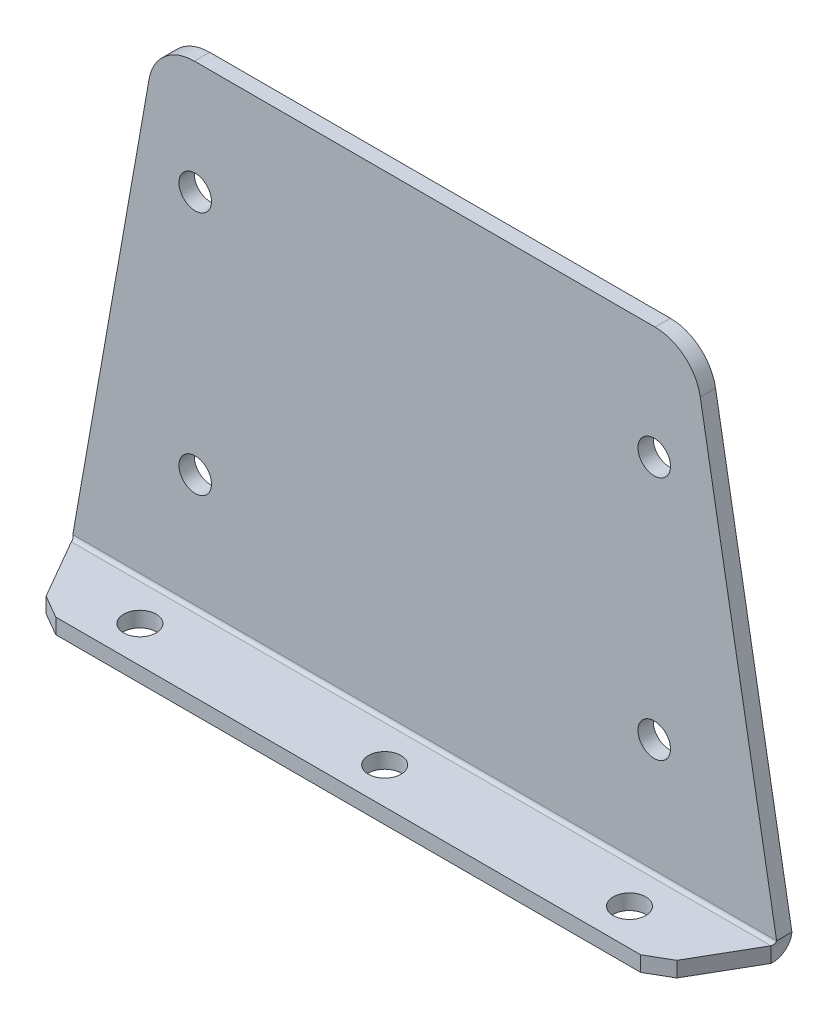
ISO-10303-21;
HEADER;
FILE_DESCRIPTION(('STEP AP214'),'2;1');
FILE_NAME('part.step','',(''),(''),'','','');
FILE_SCHEMA(('AUTOMOTIVE_DESIGN { 1 0 10303 214 1 1 1 1 }'));
ENDSEC;
DATA;
#1=APPLICATION_CONTEXT('core data for automotive mechanical design processes');
#2=APPLICATION_PROTOCOL_DEFINITION('international standard','automotive_design',2000,#1);
#3=PRODUCT_CONTEXT('',#1,'mechanical');
#4=PRODUCT('Part','Part','',(#3));
#5=PRODUCT_RELATED_PRODUCT_CATEGORY('part','',(#4));
#6=PRODUCT_DEFINITION_FORMATION('','',#4);
#7=PRODUCT_DEFINITION_CONTEXT('part definition',#1,'design');
#8=PRODUCT_DEFINITION('design','',#6,#7);
#9=PRODUCT_DEFINITION_SHAPE('','',#8);
#10=(LENGTH_UNIT() NAMED_UNIT(*) SI_UNIT(.MILLI.,.METRE.));
#11=(NAMED_UNIT(*) PLANE_ANGLE_UNIT() SI_UNIT($,.RADIAN.));
#12=(NAMED_UNIT(*) SI_UNIT($,.STERADIAN.) SOLID_ANGLE_UNIT());
#13=UNCERTAINTY_MEASURE_WITH_UNIT(LENGTH_MEASURE(1.E-05),#10,'distance_accuracy_value','');
#14=(GEOMETRIC_REPRESENTATION_CONTEXT(3) GLOBAL_UNCERTAINTY_ASSIGNED_CONTEXT((#13)) GLOBAL_UNIT_ASSIGNED_CONTEXT((#10,
#11,#12)) REPRESENTATION_CONTEXT('',''));
#15=CARTESIAN_POINT('',(0.,0.,0.));
#16=DIRECTION('',(0.,0.,1.));
#17=DIRECTION('',(1.,0.,0.));
#18=AXIS2_PLACEMENT_3D('',#15,#16,#17);
#19=CARTESIAN_POINT('',(0.,-0.7366,0.));
#20=DIRECTION('',(0.,1.,0.));
#21=DIRECTION('',(0.,0.,1.));
#22=AXIS2_PLACEMENT_3D('',#19,#20,#21);
#23=PLANE('',#22);
#24=CARTESIAN_POINT('',(123.825,-0.7366,8.3058));
#25=DIRECTION('',(0.,1.,0.));
#26=DIRECTION('',(0.,0.,1.));
#27=AXIS2_PLACEMENT_3D('',#24,#25,#26);
#28=CIRCLE('',#27,3.3782);
#29=CARTESIAN_POINT('',(123.825,-0.7366,11.684));
#30=VERTEX_POINT('',#29);
#31=EDGE_CURVE('E126',#30,#30,#28,.F.);
#32=ORIENTED_EDGE('',*,*,#31,.T.);
#33=EDGE_LOOP('',(#32));
#34=FACE_BOUND('',#33,.T.);
#35=CARTESIAN_POINT('',(73.025,-0.7366,8.3058));
#36=DIRECTION('',(0.,1.,0.));
#37=DIRECTION('',(0.,0.,1.));
#38=AXIS2_PLACEMENT_3D('',#35,#36,#37);
#39=CIRCLE('',#38,3.3782);
#40=CARTESIAN_POINT('',(73.025,-0.7366,11.684));
#41=VERTEX_POINT('',#40);
#42=EDGE_CURVE('E606',#41,#41,#39,.F.);
#43=ORIENTED_EDGE('',*,*,#42,.T.);
#44=EDGE_LOOP('',(#43));
#45=FACE_BOUND('',#44,.T.);
#46=CARTESIAN_POINT('',(22.225,-0.7366,8.3058));
#47=DIRECTION('',(0.,1.,0.));
#48=DIRECTION('',(0.,0.,1.));
#49=AXIS2_PLACEMENT_3D('',#46,#47,#48);
#50=CIRCLE('',#49,3.3782);
#51=CARTESIAN_POINT('',(22.225,-0.7366,11.684));
#52=VERTEX_POINT('',#51);
#53=EDGE_CURVE('E24',#52,#52,#50,.F.);
#54=ORIENTED_EDGE('',*,*,#53,.T.);
#55=EDGE_LOOP('',(#54));
#56=FACE_BOUND('',#55,.T.);
#57=DIRECTION('',(-0.866025403784429,0.,-0.500000000000017));
#58=VECTOR('',#57,1.);
#59=CARTESIAN_POINT('',(7.5779355233849,-0.7366,13.1253693429833));
#60=LINE('',#59,#58);
#61=CARTESIAN_POINT('',(7.57793552338496,-0.7366,13.1253693429832));
#62=VERTEX_POINT('',#61);
#63=CARTESIAN_POINT('',(12.340435523385,-0.7366,15.8749999999997));
#64=VERTEX_POINT('',#63);
#65=EDGE_CURVE('E156',#62,#64,#60,.F.);
#66=ORIENTED_EDGE('',*,*,#65,.T.);
#67=DIRECTION('',(-1.,0.,0.));
#68=VECTOR('',#67,1.);
#69=CARTESIAN_POINT('',(9.1654355233849,-0.7366,15.875));
#70=LINE('',#69,#68);
#71=CARTESIAN_POINT('',(133.709564476602,-0.7366,15.875));
#72=VERTEX_POINT('',#71);
#73=EDGE_CURVE('E171',#64,#72,#70,.F.);
#74=ORIENTED_EDGE('',*,*,#73,.T.);
#75=DIRECTION('',(-0.866025403784429,0.,0.500000000000017));
#76=VECTOR('',#75,1.);
#77=CARTESIAN_POINT('',(133.709564476602,-0.7366,15.875));
#78=LINE('',#77,#76);
#79=CARTESIAN_POINT('',(138.472064476603,-0.7366,13.1253693429839));
#80=VERTEX_POINT('',#79);
#81=EDGE_CURVE('E150',#72,#80,#78,.F.);
#82=ORIENTED_EDGE('',*,*,#81,.T.);
#83=DIRECTION('',(-0.500000000000017,0.,0.866025403784429));
#84=VECTOR('',#83,1.);
#85=CARTESIAN_POINT('',(136.884564476602,-0.7366,15.875));
#86=LINE('',#85,#84);
#87=CARTESIAN_POINT('',(145.624723791707,-0.7366,0.736600000003301));
#88=VERTEX_POINT('',#87);
#89=EDGE_CURVE('E153',#80,#88,#86,.F.);
#90=ORIENTED_EDGE('',*,*,#89,.T.);
#91=DIRECTION('',(1.,0.,0.));
#92=VECTOR('',#91,1.);
#93=CARTESIAN_POINT('',(146.05,-0.7366,0.736600000002032));
#94=LINE('',#93,#92);
#95=CARTESIAN_POINT('',(0.425276208285695,-0.7366,0.736600000001071));
#96=VERTEX_POINT('',#95);
#97=EDGE_CURVE('E80',#88,#96,#94,.F.);
#98=ORIENTED_EDGE('',*,*,#97,.T.);
#99=DIRECTION('',(-0.500000000000017,0.,-0.866025403784429));
#100=VECTOR('',#99,1.);
#101=CARTESIAN_POINT('',(0.,-0.7366,0.));
#102=LINE('',#101,#100);
#103=EDGE_CURVE('E122',#96,#62,#102,.F.);
#104=ORIENTED_EDGE('',*,*,#103,.T.);
#105=EDGE_LOOP('',(#66,#74,#82,#90,#98,#104));
#106=FACE_BOUND('',#105,.T.);
#107=ADVANCED_FACE('F17',(#34,#45,#56,#106),#23,.T.);
#108=CARTESIAN_POINT('',(136.884564476602,-3.9116,15.875));
#109=DIRECTION('',(-0.866025403784429,0.,-0.500000000000017));
#110=DIRECTION('',(-0.500000000000017,0.,0.866025403784429));
#111=AXIS2_PLACEMENT_3D('',#108,#109,#110);
#112=PLANE('',#111);
#113=DIRECTION('',(0.500000000000042,0.,-0.866025403784414));
#114=VECTOR('',#113,1.);
#115=CARTESIAN_POINT('',(138.472064476602,-3.9116,13.1253693429833));
#116=LINE('',#115,#114);
#117=CARTESIAN_POINT('',(138.472064476603,-3.9116,13.1253693429835));
#118=VERTEX_POINT('',#117);
#119=CARTESIAN_POINT('',(145.624723791712,-3.9116,0.736600000017182));
#120=VERTEX_POINT('',#119);
#121=EDGE_CURVE('E84',#118,#120,#116,.T.);
#122=ORIENTED_EDGE('',*,*,#121,.T.);
#123=DIRECTION('',(3.71810476437757E-12,-1.,8.74416762703518E-12));
#124=VECTOR('',#123,1.);
#125=CARTESIAN_POINT('',(145.624723791716,-2.3241794487742,0.736600000020483));
#126=LINE('',#125,#124);
#127=EDGE_CURVE('E85',#88,#120,#126,.T.);
#128=ORIENTED_EDGE('',*,*,#127,.F.);
#129=ORIENTED_EDGE('',*,*,#89,.F.);
#130=DIRECTION('',(0.,1.,0.));
#131=VECTOR('',#130,1.);
#132=CARTESIAN_POINT('',(138.472064476603,-3.9116,13.125369342984));
#133=LINE('',#132,#131);
#134=EDGE_CURVE('E147',#80,#118,#133,.F.);
#135=ORIENTED_EDGE('',*,*,#134,.T.);
#136=EDGE_LOOP('',(#122,#128,#129,#135));
#137=FACE_BOUND('',#136,.T.);
#138=ADVANCED_FACE('F289',(#137),#112,.F.);
#139=CARTESIAN_POINT('',(7.5779355233849,-3.9116,13.1253693429833));
#140=DIRECTION('',(0.500000000000017,0.,-0.866025403784429));
#141=DIRECTION('',(-0.866025403784429,0.,-0.500000000000017));
#142=AXIS2_PLACEMENT_3D('',#139,#140,#141);
#143=PLANE('',#142);
#144=ORIENTED_EDGE('',*,*,#65,.F.);
#145=DIRECTION('',(0.,1.,0.));
#146=VECTOR('',#145,1.);
#147=CARTESIAN_POINT('',(7.57793552338496,-3.9116,13.1253693429832));
#148=LINE('',#147,#146);
#149=CARTESIAN_POINT('',(7.57793552338492,-3.9116,13.1253693429832));
#150=VERTEX_POINT('',#149);
#151=EDGE_CURVE('E125',#62,#150,#148,.F.);
#152=ORIENTED_EDGE('',*,*,#151,.T.);
#153=DIRECTION('',(0.866025403784348,0.,0.500000000000157));
#154=VECTOR('',#153,1.);
#155=CARTESIAN_POINT('',(7.5779355233849,-3.9116,13.1253693429833));
#156=LINE('',#155,#154);
#157=CARTESIAN_POINT('',(12.340435523385,-3.91159998806136,15.875));
#158=VERTEX_POINT('',#157);
#159=EDGE_CURVE('E134',#150,#158,#156,.T.);
#160=ORIENTED_EDGE('',*,*,#159,.T.);
#161=DIRECTION('',(0.,1.,0.));
#162=VECTOR('',#161,1.);
#163=CARTESIAN_POINT('',(12.3404355233849,-3.9116,15.875));
#164=LINE('',#163,#162);
#165=EDGE_CURVE('E161',#158,#64,#164,.T.);
#166=ORIENTED_EDGE('',*,*,#165,.T.);
#167=EDGE_LOOP('',(#144,#152,#160,#166));
#168=FACE_BOUND('',#167,.T.);
#169=ADVANCED_FACE('F293',(#168),#143,.F.);
#170=CARTESIAN_POINT('',(9.1654355233849,-3.9116,15.875));
#171=DIRECTION('',(0.,0.,-1.));
#172=DIRECTION('',(-1.,0.,0.));
#173=AXIS2_PLACEMENT_3D('',#170,#171,#172);
#174=PLANE('',#173);
#175=ORIENTED_EDGE('',*,*,#73,.F.);
#176=ORIENTED_EDGE('',*,*,#165,.F.);
#177=DIRECTION('',(1.,0.,0.));
#178=VECTOR('',#177,1.);
#179=CARTESIAN_POINT('',(0.,-3.9116,15.875));
#180=LINE('',#179,#178);
#181=CARTESIAN_POINT('',(133.709564476602,-3.91159996269216,15.875));
#182=VERTEX_POINT('',#181);
#183=EDGE_CURVE('E137',#158,#182,#180,.T.);
#184=ORIENTED_EDGE('',*,*,#183,.T.);
#185=DIRECTION('',(0.,1.,0.));
#186=VECTOR('',#185,1.);
#187=CARTESIAN_POINT('',(133.709564476602,-3.9116,15.875));
#188=LINE('',#187,#186);
#189=EDGE_CURVE('E166',#182,#72,#188,.T.);
#190=ORIENTED_EDGE('',*,*,#189,.T.);
#191=EDGE_LOOP('',(#175,#176,#184,#190));
#192=FACE_BOUND('',#191,.T.);
#193=ADVANCED_FACE('F297',(#192),#174,.F.);
#194=CARTESIAN_POINT('',(133.709564476602,-3.9116,15.875));
#195=DIRECTION('',(-0.500000000000017,0.,-0.866025403784429));
#196=DIRECTION('',(-0.866025403784429,0.,0.500000000000017));
#197=AXIS2_PLACEMENT_3D('',#194,#195,#196);
#198=PLANE('',#197);
#199=ORIENTED_EDGE('',*,*,#81,.F.);
#200=ORIENTED_EDGE('',*,*,#189,.F.);
#201=DIRECTION('',(0.866025403784348,0.,-0.500000000000156));
#202=VECTOR('',#201,1.);
#203=CARTESIAN_POINT('',(133.709564476602,-3.9116,15.875));
#204=LINE('',#203,#202);
#205=EDGE_CURVE('E141',#182,#118,#204,.T.);
#206=ORIENTED_EDGE('',*,*,#205,.T.);
#207=ORIENTED_EDGE('',*,*,#134,.F.);
#208=EDGE_LOOP('',(#199,#200,#206,#207));
#209=FACE_BOUND('',#208,.T.);
#210=ADVANCED_FACE('F301',(#209),#198,.F.);
#211=CARTESIAN_POINT('',(22.225,-3.9116,8.3058));
#212=DIRECTION('',(0.,1.,0.));
#213=DIRECTION('',(0.,0.,1.));
#214=AXIS2_PLACEMENT_3D('',#211,#212,#213);
#215=CYLINDRICAL_SURFACE('',#214,3.3782);
#216=ORIENTED_EDGE('',*,*,#53,.F.);
#217=EDGE_LOOP('',(#216));
#218=FACE_BOUND('',#217,.T.);
#219=CARTESIAN_POINT('',(22.225,-3.9116,8.3058));
#220=DIRECTION('',(0.,1.,0.));
#221=DIRECTION('',(0.,0.,1.));
#222=AXIS2_PLACEMENT_3D('',#219,#220,#221);
#223=CIRCLE('',#222,3.3782);
#224=CARTESIAN_POINT('',(22.225,-3.9116,11.684));
#225=VERTEX_POINT('',#224);
#226=EDGE_CURVE('E144',#225,#225,#223,.F.);
#227=ORIENTED_EDGE('',*,*,#226,.T.);
#228=EDGE_LOOP('',(#227));
#229=FACE_BOUND('',#228,.T.);
#230=ADVANCED_FACE('F305',(#218,#229),#215,.F.);
#231=CARTESIAN_POINT('',(73.025,-3.9116,8.3058));
#232=DIRECTION('',(0.,1.,0.));
#233=DIRECTION('',(0.,0.,1.));
#234=AXIS2_PLACEMENT_3D('',#231,#232,#233);
#235=CYLINDRICAL_SURFACE('',#234,3.3782);
#236=ORIENTED_EDGE('',*,*,#42,.F.);
#237=EDGE_LOOP('',(#236));
#238=FACE_BOUND('',#237,.T.);
#239=CARTESIAN_POINT('',(73.025,-3.9116,8.3058));
#240=DIRECTION('',(0.,1.,0.));
#241=DIRECTION('',(0.,0.,1.));
#242=AXIS2_PLACEMENT_3D('',#239,#240,#241);
#243=CIRCLE('',#242,3.3782);
#244=CARTESIAN_POINT('',(73.025,-3.9116,11.684));
#245=VERTEX_POINT('',#244);
#246=EDGE_CURVE('E429',#245,#245,#243,.F.);
#247=ORIENTED_EDGE('',*,*,#246,.T.);
#248=EDGE_LOOP('',(#247));
#249=FACE_BOUND('',#248,.T.);
#250=ADVANCED_FACE('F309',(#238,#249),#235,.F.);
#251=CARTESIAN_POINT('',(123.825,-3.9116,8.3058));
#252=DIRECTION('',(0.,1.,0.));
#253=DIRECTION('',(0.,0.,1.));
#254=AXIS2_PLACEMENT_3D('',#251,#252,#253);
#255=CYLINDRICAL_SURFACE('',#254,3.3782);
#256=ORIENTED_EDGE('',*,*,#31,.F.);
#257=EDGE_LOOP('',(#256));
#258=FACE_BOUND('',#257,.T.);
#259=CARTESIAN_POINT('',(123.825,-3.9116,8.3058));
#260=DIRECTION('',(0.,1.,0.));
#261=DIRECTION('',(0.,0.,1.));
#262=AXIS2_PLACEMENT_3D('',#259,#260,#261);
#263=CIRCLE('',#262,3.3782);
#264=CARTESIAN_POINT('',(123.825,-3.9116,11.684));
#265=VERTEX_POINT('',#264);
#266=EDGE_CURVE('E427',#265,#265,#263,.F.);
#267=ORIENTED_EDGE('',*,*,#266,.T.);
#268=EDGE_LOOP('',(#267));
#269=FACE_BOUND('',#268,.T.);
#270=ADVANCED_FACE('F312',(#258,#269),#255,.F.);
#271=CARTESIAN_POINT('',(0.,-3.9116,0.));
#272=DIRECTION('',(0.866025403784429,0.,-0.500000000000017));
#273=DIRECTION('',(-0.500000000000017,0.,-0.866025403784429));
#274=AXIS2_PLACEMENT_3D('',#271,#272,#273);
#275=PLANE('',#274);
#276=ORIENTED_EDGE('',*,*,#103,.F.);
#277=DIRECTION('',(0.,1.,0.));
#278=VECTOR('',#277,1.);
#279=CARTESIAN_POINT('',(0.425276208285053,-2.32417944833777,0.73660000000004));
#280=LINE('',#279,#278);
#281=CARTESIAN_POINT('',(0.425276208285358,-3.9116,0.736600000000482));
#282=VERTEX_POINT('',#281);
#283=EDGE_CURVE('E98',#282,#96,#280,.T.);
#284=ORIENTED_EDGE('',*,*,#283,.F.);
#285=DIRECTION('',(0.500000000000012,0.,0.866025403784432));
#286=VECTOR('',#285,1.);
#287=CARTESIAN_POINT('',(0.4252762082851,-3.9116,0.7366));
#288=LINE('',#287,#286);
#289=EDGE_CURVE('E138',#282,#150,#288,.T.);
#290=ORIENTED_EDGE('',*,*,#289,.T.);
#291=ORIENTED_EDGE('',*,*,#151,.F.);
#292=EDGE_LOOP('',(#276,#284,#290,#291));
#293=FACE_BOUND('',#292,.T.);
#294=ADVANCED_FACE('F260',(#293),#275,.F.);
#295=CARTESIAN_POINT('',(146.05,0.,0.7366));
#296=DIRECTION('',(1.,0.,0.));
#297=DIRECTION('',(0.,0.,-1.));
#298=AXIS2_PLACEMENT_3D('',#295,#296,#297);
#299=CYLINDRICAL_SURFACE('',#298,0.7366);
#300=ORIENTED_EDGE('',*,*,#97,.F.);
#301=CARTESIAN_POINT('',(146.04999999999,1.1067328360326E-12,0.));
#302=CARTESIAN_POINT('',(146.033761789014,-0.0441889016254141,-4.553203150032E-05));
#303=CARTESIAN_POINT('',(146.017524010753,-0.0883634020784472,0.00397345733484728));
#304=CARTESIAN_POINT('',(145.985061173071,-0.175256986932487,0.0198050848037792));
#305=CARTESIAN_POINT('',(145.968836114294,-0.21797725044977,0.031611242645291));
#306=CARTESIAN_POINT('',(145.936374648382,-0.30063656916147,0.0626913891340414));
#307=CARTESIAN_POINT('',(145.920138239916,-0.340574080078137,0.0819694859722505));
#308=CARTESIAN_POINT('',(145.887675090312,-0.416347638988337,0.12735245340074));
#309=CARTESIAN_POINT('',(145.871448347746,-0.45218479245855,0.153455477692408));
#310=CARTESIAN_POINT('',(145.838992329576,-0.518603315317671,0.21164313271838));
#311=CARTESIAN_POINT('',(145.822763055231,-0.549185793515106,0.243726498532291));
#312=CARTESIAN_POINT('',(145.790311107363,-0.60412072947896,0.312848003192188));
#313=CARTESIAN_POINT('',(145.774088433644,-0.62847338760231,0.349885982634735));
#314=CARTESIAN_POINT('',(145.741626857501,-0.67017638253569,0.427737265437257));
#315=CARTESIAN_POINT('',(145.725387951725,-0.687521744150973,0.468553225988095));
#316=CARTESIAN_POINT('',(145.692927926748,-0.714610257306961,0.552602413483236));
#317=CARTESIAN_POINT('',(145.676706814498,-0.724364024425833,0.59583217408322));
#318=CARTESIAN_POINT('',(145.654534749005,-0.732317760925936,0.655633121450345));
#319=CARTESIAN_POINT('',(145.648567129784,-0.733924220432763,0.671799270050664));
#320=CARTESIAN_POINT('',(145.636641875988,-0.736063987553253,0.704174645253995));
#321=CARTESIAN_POINT('',(145.630684241773,-0.736599124021749,0.720383751063802));
#322=CARTESIAN_POINT('',(145.624723791714,-0.736600000000001,0.736600000007147));
#323=B_SPLINE_CURVE_WITH_KNOTS('',3,(#301,#302,#303,#304,#305,#306,#307,#308,#309,#310,#311,
#312,#313,#314,#315,#316,#317,#318,#319,#320,#321,#322),.UNSPECIFIED.,.F.,.F.,(4,2,2,2,2,2,2,2,
2,2,4),(0.,0.141043225038701,0.281969225733589,0.422972819953411,0.563938308879362,
0.704874015525676,0.845805188975791,0.986836248727522,1.12766974399173,1.17956570731466,
1.2313730032717),.UNSPECIFIED.);
#324=CARTESIAN_POINT('',(146.04999999999,0.,0.));
#325=VERTEX_POINT('',#324);
#326=EDGE_CURVE('E75',#325,#88,#323,.T.);
#327=ORIENTED_EDGE('',*,*,#326,.F.);
#328=DIRECTION('',(-1.,0.,0.));
#329=VECTOR('',#328,1.);
#330=CARTESIAN_POINT('',(0.,2.5943691639437E-13,0.));
#331=LINE('',#330,#329);
#332=CARTESIAN_POINT('',(0.,1.29718458197185E-13,0.));
#333=VERTEX_POINT('',#332);
#334=EDGE_CURVE('E79',#325,#333,#331,.T.);
#335=ORIENTED_EDGE('',*,*,#334,.T.);
#336=CARTESIAN_POINT('',(0.425276208285155,-0.7366,0.736600000000611));
#337=CARTESIAN_POINT('',(0.409037997312601,-0.73664553203122,0.692411098372825));
#338=CARTESIAN_POINT('',(0.392800219051563,-0.732626542664846,0.648236597919876));
#339=CARTESIAN_POINT('',(0.36033738136548,-0.716794915196108,0.561343013066884));
#340=CARTESIAN_POINT('',(0.344112322586021,-0.704988757354814,0.518622749550563));
#341=CARTESIAN_POINT('',(0.311650856670152,-0.673908610866497,0.435963430839904));
#342=CARTESIAN_POINT('',(0.295414448204115,-0.654630514028509,0.396025919923314));
#343=CARTESIAN_POINT('',(0.262951298600196,-0.609247546600037,0.320252361012778));
#344=CARTESIAN_POINT('',(0.246724556035551,-0.583144522308163,0.284415207542153));
#345=CARTESIAN_POINT('',(0.214268537867224,-0.524956867281687,0.217996684682353));
#346=CARTESIAN_POINT('',(0.198039263523012,-0.492873501467467,0.187414206484658));
#347=CARTESIAN_POINT('',(0.165587315655527,-0.42375199680707,0.132479270520495));
#348=CARTESIAN_POINT('',(0.149364641936729,-0.386714017364332,0.108126612397097));
#349=CARTESIAN_POINT('',(0.116903065795111,-0.308862734561835,0.0664236174639173));
#350=CARTESIAN_POINT('',(0.10066416001934,-0.268046774011259,0.049078255848796));
#351=CARTESIAN_POINT('',(0.0682041350426737,-0.183997586516882,0.0219897426930994));
#352=CARTESIAN_POINT('',(0.0519830227925919,-0.140767825917399,0.0122359755743621));
#353=CARTESIAN_POINT('',(0.029810957296554,-0.0809668785521213,0.00428223907434967));
#354=CARTESIAN_POINT('',(0.0238433380752774,-0.0648007299525817,0.0026757795675426));
#355=CARTESIAN_POINT('',(0.0119180842765338,-0.0324253547510271,0.000536012446988639));
#356=CARTESIAN_POINT('',(0.00596045006024207,-0.0162162489422153,8.75978408253096E-07));
#357=CARTESIAN_POINT('',(0.,0.,0.));
#358=B_SPLINE_CURVE_WITH_KNOTS('',3,(#336,#337,#338,#339,#340,#341,#342,#343,#344,#345,#346,
#347,#348,#349,#350,#351,#352,#353,#354,#355,#356,#357),.UNSPECIFIED.,.F.,.F.,(4,2,2,2,2,2,2,2,
2,2,4),(0.,0.141043225038912,0.281969225734052,0.422972819954025,0.563938308880143,
0.704874015526822,0.845805188977319,0.986836248727671,1.1276697439906,1.1795657073122,
1.23137300326793),.UNSPECIFIED.);
#359=EDGE_CURVE('E264',#96,#333,#358,.T.);
#360=ORIENTED_EDGE('',*,*,#359,.F.);
#361=EDGE_LOOP('',(#300,#327,#335,#360));
#362=FACE_BOUND('',#361,.T.);
#363=ADVANCED_FACE('F77',(#362),#299,.F.);
#364=CARTESIAN_POINT('',(145.587612544005,-4.08738304657646,1.30062531070989));
#365=CARTESIAN_POINT('',(145.587613050227,-2.8970504975562,1.13636788014082));
#366=CARTESIAN_POINT('',(145.587613556423,-1.70671794853797,0.972110449572012));
#367=CARTESIAN_POINT('',(145.58761406262,-0.516385399518982,0.807853019003202));
#368=CARTESIAN_POINT('',(145.599984752966,-4.11389296873304,1.11373103709075));
#369=CARTESIAN_POINT('',(145.599985013113,-2.91584016529048,1.00390181703589));
#370=CARTESIAN_POINT('',(145.59998527326,-1.71778736184614,0.89407259698077));
#371=CARTESIAN_POINT('',(145.599985533432,-0.519734558402312,0.784243376925908));
#372=CARTESIAN_POINT('',(145.647805286687,-4.16445919940632,0.384702751266314));
#373=CARTESIAN_POINT('',(145.647804928217,-2.9516804357434,0.487183613372252));
#374=CARTESIAN_POINT('',(145.647804569721,-1.73890167207972,0.589664475478444));
#375=CARTESIAN_POINT('',(145.647804211251,-0.526122908416798,0.692145337584382));
#376=CARTESIAN_POINT('',(145.731039991693,-3.91208361052884,-0.883754332543426));
#377=CARTESIAN_POINT('',(145.73104011468,-2.7728019939582,-0.411873159233492));
#378=CARTESIAN_POINT('',(145.731040237641,-1.63352037739061,0.0600080140765182));
#379=CARTESIAN_POINT('',(145.731040360628,-0.494238760822,0.531889187386376));
#380=CARTESIAN_POINT('',(145.837361895838,-2.99420532751336,-2.25760532654384));
#381=CARTESIAN_POINT('',(145.837361895838,-2.12222919865427,-1.38562919796898));
#382=CARTESIAN_POINT('',(145.837361895838,-1.25025306979595,-0.513653069394372));
#383=CARTESIAN_POINT('',(145.837361895838,-0.378276940937874,0.35832305918049));
#384=CARTESIAN_POINT('',(145.943683800085,-1.62035432965951,-3.17548361151944));
#385=CARTESIAN_POINT('',(145.943683677098,-1.14847315719413,-2.03620199466076));
#386=CARTESIAN_POINT('',(145.943683554112,-0.676591984728996,-0.89692037780285));
#387=CARTESIAN_POINT('',(145.943683431125,-0.204710812263688,0.242361239054861));
#388=CARTESIAN_POINT('',(146.026923596928,-0.351819656636902,-3.42787463672622));
#389=CARTESIAN_POINT('',(146.026923955423,-0.249361390903069,-2.21509137738751));
#390=CARTESIAN_POINT('',(146.026924313919,-0.146903125169235,-1.00230811804905));
#391=CARTESIAN_POINT('',(146.026924672414,-0.0444448594354018,0.21047514128916));
#392=CARTESIAN_POINT('',(146.074749227311,0.377286366246688,-3.377282194622));
#393=CARTESIAN_POINT('',(146.074748967012,0.267411910700382,-2.17923252882849));
#394=CARTESIAN_POINT('',(146.074748706713,0.157537455154152,-0.981182863033702));
#395=CARTESIAN_POINT('',(146.074748446414,0.0476629996078208,0.21686680276093));
#396=CARTESIAN_POINT('',(146.087126533037,0.564256217279822,-3.35075029134352));
#397=CARTESIAN_POINT('',(146.08712602651,0.399931541018478,-2.16042728134431));
#398=CARTESIAN_POINT('',(146.087125519983,0.235606864757236,-0.970104271346124));
#399=CARTESIAN_POINT('',(146.087125013482,0.071282188495917,0.220218738652041));
#400=B_SPLINE_SURFACE_WITH_KNOTS('',3,3,((#364,#365,#366,#367),(#368,#369,#370,#371),(#372,#373,
#374,#375),(#376,#377,#378,#379),(#380,#381,#382,#383),(#384,#385,#386,#387),(#388,#389,#390,
#391),(#392,#393,#394,#395),(#396,#397,#398,#399)),.UNSPECIFIED.,.F.,.F.,.F.,(4,1,1,1,1,1,4),(4,
4),(-0.08723626480821,0.,0.2500000000036,0.5000000000014,0.7499999999991,1.,1.087272189861),
(4.543612969893E-08,0.9999983845735),.UNSPECIFIED.);
#401=DIRECTION('',(0.,0.,1.));
#402=VECTOR('',#401,1.);
#403=CARTESIAN_POINT('',(146.049999999991,-1.29063426612674E-12,-3.175));
#404=LINE('',#403,#402);
#405=CARTESIAN_POINT('',(146.050000000001,-1.07167929034386E-12,-3.175));
#406=VERTEX_POINT('',#405);
#407=EDGE_CURVE('E101',#325,#406,#404,.F.);
#408=CARTESIAN_POINT('',(146.050000000012,-1.15788851248873E-12,-3.175));
#409=CARTESIAN_POINT('',(146.042366379942,-0.110287051827059,-3.1750106504649));
#410=CARTESIAN_POINT('',(146.034733349952,-0.220569103955943,-3.17033574655556));
#411=CARTESIAN_POINT('',(146.019468097599,-0.440340357702033,-3.15169721503877));
#412=CARTESIAN_POINT('',(146.011835875214,-0.549829597303584,-3.13773403545749));
#413=CARTESIAN_POINT('',(145.99657690979,-0.767160833072703,-3.10061538433101));
#414=CARTESIAN_POINT('',(145.988950166979,-0.87500401399972,-3.07746688270379));
#415=CARTESIAN_POINT('',(145.973697635792,-1.08832405707029,-3.02216621495021));
#416=CARTESIAN_POINT('',(145.966071847405,-1.19380094819698,-2.99001415916763));
#417=CARTESIAN_POINT('',(145.943187600084,-1.50565949116411,-2.88031381871414));
#418=CARTESIAN_POINT('',(145.927916173151,-1.70755692063769,-2.78950626613435));
#419=CARTESIAN_POINT('',(145.897391584483,-2.0930415727871,-2.57526926086324));
#420=CARTESIAN_POINT('',(145.882138419965,-2.27663206998078,-2.45184565659635));
#421=CARTESIAN_POINT('',(145.851623266357,-2.62045073735799,-2.17585904842747));
#422=CARTESIAN_POINT('',(145.836361277541,-2.78067959717646,-2.02329690500167));
#423=CARTESIAN_POINT('',(145.805840405345,-3.07320364485422,-1.69334983956957));
#424=CARTESIAN_POINT('',(145.790581523229,-3.20549314300702,-1.51595987371144));
#425=CARTESIAN_POINT('',(145.760058137519,-3.43835377276583,-1.14142802738998));
#426=CARTESIAN_POINT('',(145.744793633415,-3.53891840324426,-0.944282109386946));
#427=CARTESIAN_POINT('',(145.714267861359,-3.70538095861543,-0.535920177982979));
#428=CARTESIAN_POINT('',(145.69900659717,-3.7713001203934,-0.324712873568766));
#429=CARTESIAN_POINT('',(145.673908650463,-3.84976081565101,0.0293177148548672));
#430=CARTESIAN_POINT('',(145.664064602811,-3.87293787192361,0.169874407033624));
#431=CARTESIAN_POINT('',(145.644390251638,-3.90385445511806,0.452467602052166));
#432=CARTESIAN_POINT('',(145.634559949003,-3.9116164382541,0.594501648836979));
#433=CARTESIAN_POINT('',(145.624723791727,-3.91159999999999,0.736600000015479));
#434=B_SPLINE_CURVE_WITH_KNOTS('',3,(#408,#409,#410,#411,#412,#413,#414,#415,#416,#417,#418,
#419,#420,#421,#422,#423,#424,#425,#426,#427,#428,#429,#430,#431,#432,#433),.UNSPECIFIED.,.F.,
.F.,(4,2,2,2,2,2,2,2,2,2,2,2,4),(0.,0.331544885302928,0.663073779477025,0.994351585685523,
1.3256253320707,1.98790799778779,2.6500719892689,3.31221642972612,3.97449558273064,
4.63691036336616,5.29891862381989,5.72651984304269,6.15349768742148),.UNSPECIFIED.);
#435=EDGE_CURVE('E104',#406,#120,#434,.T.);
#436=ORIENTED_EDGE('',*,*,#407,.F.);
#437=ORIENTED_EDGE('',*,*,#326,.T.);
#438=ORIENTED_EDGE('',*,*,#127,.T.);
#439=ORIENTED_EDGE('',*,*,#435,.F.);
#440=EDGE_LOOP('',(#436,#437,#438,#439));
#441=FACE_BOUND('',#440,.T.);
#442=ADVANCED_FACE('F102',(#441),#400,.T.);
#443=CARTESIAN_POINT('',(0.,-3.9116,0.));
#444=DIRECTION('',(0.,1.,0.));
#445=DIRECTION('',(0.,0.,1.));
#446=AXIS2_PLACEMENT_3D('',#443,#444,#445);
#447=PLANE('',#446);
#448=ORIENTED_EDGE('',*,*,#266,.F.);
#449=EDGE_LOOP('',(#448));
#450=FACE_BOUND('',#449,.T.);
#451=ORIENTED_EDGE('',*,*,#246,.F.);
#452=EDGE_LOOP('',(#451));
#453=FACE_BOUND('',#452,.T.);
#454=ORIENTED_EDGE('',*,*,#226,.F.);
#455=EDGE_LOOP('',(#454));
#456=FACE_BOUND('',#455,.T.);
#457=ORIENTED_EDGE('',*,*,#183,.F.);
#458=ORIENTED_EDGE('',*,*,#159,.F.);
#459=ORIENTED_EDGE('',*,*,#289,.F.);
#460=DIRECTION('',(1.,0.,0.));
#461=VECTOR('',#460,1.);
#462=CARTESIAN_POINT('',(146.05,-3.9116,0.736600000001015));
#463=LINE('',#462,#461);
#464=EDGE_CURVE('E222',#120,#282,#463,.F.);
#465=ORIENTED_EDGE('',*,*,#464,.F.);
#466=ORIENTED_EDGE('',*,*,#121,.F.);
#467=ORIENTED_EDGE('',*,*,#205,.F.);
#468=EDGE_LOOP('',(#457,#458,#459,#465,#466,#467));
#469=FACE_BOUND('',#468,.T.);
#470=ADVANCED_FACE('F253',(#450,#453,#456,#469),#447,.F.);
#471=CARTESIAN_POINT('',(-0.0371112477279784,0.564025310545294,-3.35078304571794));
#472=CARTESIAN_POINT('',(-0.0371107415195166,0.399767880029316,-2.16045049698521));
#473=CARTESIAN_POINT('',(-0.0371102353110294,0.23551044951344,-0.970117948252476));
#474=CARTESIAN_POINT('',(-0.0371097291025676,0.0712530189974616,0.22021460048018));
#475=CARTESIAN_POINT('',(-0.0247390387692429,0.37713103697213,-3.3772929678669));
#476=CARTESIAN_POINT('',(-0.0247387786113913,0.267301816955114,-2.17924016471238));
#477=CARTESIAN_POINT('',(-0.0247385184535372,0.157472596938047,-0.981187361557598));
#478=CARTESIAN_POINT('',(-0.0247382582956857,0.0476433769210058,0.216865441597231));
#479=CARTESIAN_POINT('',(0.02308149496865,-0.351897248678568,-3.4278591985224));
#480=CARTESIAN_POINT('',(0.0230811364953284,-0.249416386591883,-2.2150804351531));
#481=CARTESIAN_POINT('',(0.0230807780220092,-0.146935524505122,-1.00230167178482));
#482=CARTESIAN_POINT('',(0.0230804195486901,-0.0444546624183866,0.21047709158338));
#483=CARTESIAN_POINT('',(0.106316199983177,-1.62035433220078,-3.17548360969826));
#484=CARTESIAN_POINT('',(0.106316322962306,-1.14847315900489,-2.03620199340677));
#485=CARTESIAN_POINT('',(0.106316445941435,-0.676591985809258,-0.89692037711451));
#486=CARTESIAN_POINT('',(0.106316568920564,-0.204710812613599,0.242361239178));
#487=CARTESIAN_POINT('',(0.21263810413018,-2.99420532591062,-2.25760532687861));
#488=CARTESIAN_POINT('',(0.212638104130714,-2.12222919754683,-1.38562919823162));
#489=CARTESIAN_POINT('',(0.212638104131247,-1.2502530691833,-0.513653069584872));
#490=CARTESIAN_POINT('',(0.21263810413178,-0.37827694081951,0.358323059062126));
#491=CARTESIAN_POINT('',(0.318960008351504,-3.91208361068886,-0.883754329316864));
#492=CARTESIAN_POINT('',(0.318959885370038,-2.77280199410806,-0.41187315696578));
#493=CARTESIAN_POINT('',(0.318959762388826,-1.63352037752675,0.060008015385431));
#494=CARTESIAN_POINT('',(0.31895963940736,-0.49423876094519,0.531889187736388));
#495=CARTESIAN_POINT('',(0.40219980519873,-4.1644746358423,0.384780343425328));
#496=CARTESIAN_POINT('',(0.40220016370703,-2.95169137679848,0.487238609138054));
#497=CARTESIAN_POINT('',(0.402200522215076,-1.73890811775466,0.589696874850526));
#498=CARTESIAN_POINT('',(0.402200880723122,-0.526124858710586,0.692155140563252));
#499=CARTESIAN_POINT('',(0.450025435581822,-4.11388219375332,1.11388636614229));
#500=CARTESIAN_POINT('',(0.45002517528821,-2.91583252824962,1.00401191062977));
#501=CARTESIAN_POINT('',(0.450024914994598,-1.71778286274389,0.894137455117246));
#502=CARTESIAN_POINT('',(0.450024654700986,-0.519733197239172,0.784262999604722));
#503=CARTESIAN_POINT('',(0.462402741310778,-4.08735029047992,1.30085621712996));
#504=CARTESIAN_POINT('',(0.462402234790582,-2.89702728077002,1.13653154091739));
#505=CARTESIAN_POINT('',(0.46240172827064,-1.70670427105885,0.97220686470481));
#506=CARTESIAN_POINT('',(0.462401221750444,-0.516381261348442,0.80788218849198));
#507=B_SPLINE_SURFACE_WITH_KNOTS('',3,3,((#471,#472,#473,#474),(#475,#476,#477,#478),(#479,#480,
#481,#482),(#483,#484,#485,#486),(#487,#488,#489,#490),(#491,#492,#493,#494),(#495,#496,#497,
#498),(#499,#500,#501,#502),(#503,#504,#505,#506)),.UNSPECIFIED.,.F.,.F.,.F.,(4,1,1,1,1,1,4),(4,
4),(-0.08723626480589,0.,0.2499999999998,0.4999999999998,0.7499999999997,1.,1.08727218986),
(4.505509384328E-08,0.9999983845735),.UNSPECIFIED.);
#508=CARTESIAN_POINT('',(0.425276208285114,-3.9116,0.736600000000404));
#509=CARTESIAN_POINT('',(0.417642588215241,-3.91161065046495,0.62631294817455));
#510=CARTESIAN_POINT('',(0.410009558225287,-3.90693574655565,0.516030896045715));
#511=CARTESIAN_POINT('',(0.394744305871536,-3.88829721503897,0.29625964229972));
#512=CARTESIAN_POINT('',(0.387112083486543,-3.87433403545774,0.186770402698215));
#513=CARTESIAN_POINT('',(0.371853118062408,-3.83721538433139,-0.030560833070818));
#514=CARTESIAN_POINT('',(0.364226375251249,-3.81406688270423,-0.138404013997795));
#515=CARTESIAN_POINT('',(0.348973844063834,-3.75876621495078,-0.351724057068312));
#516=CARTESIAN_POINT('',(0.341348055677026,-3.72661415916827,-0.457200948194989));
#517=CARTESIAN_POINT('',(0.318463808356487,-3.61691381871497,-0.769059491162142));
#518=CARTESIAN_POINT('',(0.303192381425579,-3.52610626613526,-0.970956920635813));
#519=CARTESIAN_POINT('',(0.272667792761912,-3.31186926086427,-1.35644157278547));
#520=CARTESIAN_POINT('',(0.257414628246566,-3.1884456565974,-1.54003206997931));
#521=CARTESIAN_POINT('',(0.226899474643139,-2.91245904842867,-1.88385073735665));
#522=CARTESIAN_POINT('',(0.211637485828908,-2.75989690500302,-2.04407959717511));
#523=CARTESIAN_POINT('',(0.181116613634918,-2.42994983957133,-2.33660364485282));
#524=CARTESIAN_POINT('',(0.16585773151867,-2.25255987371347,-2.46889314300558));
#525=CARTESIAN_POINT('',(0.135334345808393,-1.87802802739253,-2.70175377276442));
#526=CARTESIAN_POINT('',(0.120069841703081,-1.68088210938976,-2.80231840324291));
#527=CARTESIAN_POINT('',(0.0895440696450196,-1.27252017798635,-2.96878095861426));
#528=CARTESIAN_POINT('',(0.0742828054551907,-1.06131287357243,-3.03470012039235));
#529=CARTESIAN_POINT('',(0.0491848587453539,-0.707282285151048,-3.11316081564986));
#530=CARTESIAN_POINT('',(0.0393408110916334,-0.566725592974268,-3.13633787192238));
#531=CARTESIAN_POINT('',(0.0196664599157955,-0.284132397959738,-3.16725445511713));
#532=CARTESIAN_POINT('',(0.0098361572784867,-0.14209835117696,-3.17501643825352));
#533=CARTESIAN_POINT('',(0.,-4.95048864112134E-13,-3.17499999999999));
#534=B_SPLINE_CURVE_WITH_KNOTS('',3,(#508,#509,#510,#511,#512,#513,#514,#515,#516,#517,#518,
#519,#520,#521,#522,#523,#524,#525,#526,#527,#528,#529,#530,#531,#532,#533),.UNSPECIFIED.,.F.,
.F.,(4,2,2,2,2,2,2,2,2,2,2,2,4),(0.,0.331544885302812,0.663073779476796,0.994351585685186,
1.32562533207025,1.98790799778716,2.65007198926806,3.31221642972455,3.97449558272835,
4.63691036336342,5.2989186238167,5.72651984303395,6.15349768740719),.UNSPECIFIED.);
#535=CARTESIAN_POINT('',(0.,-3.40152935135619E-13,-3.175));
#536=VERTEX_POINT('',#535);
#537=EDGE_CURVE('E215',#282,#536,#534,.T.);
#538=DIRECTION('',(0.,0.,1.));
#539=VECTOR('',#538,1.);
#540=CARTESIAN_POINT('',(0.,0.,-3.175));
#541=LINE('',#540,#539);
#542=EDGE_CURVE('E39',#536,#333,#541,.T.);
#543=ORIENTED_EDGE('',*,*,#537,.F.);
#544=ORIENTED_EDGE('',*,*,#283,.T.);
#545=ORIENTED_EDGE('',*,*,#359,.T.);
#546=ORIENTED_EDGE('',*,*,#542,.F.);
#547=EDGE_LOOP('',(#543,#544,#545,#546));
#548=FACE_BOUND('',#547,.T.);
#549=ADVANCED_FACE('F19',(#548),#507,.T.);
#550=CARTESIAN_POINT('',(0.,0.,0.));
#551=DIRECTION('',(0.,0.,-1.));
#552=DIRECTION('',(-1.,0.,0.));
#553=AXIS2_PLACEMENT_3D('',#550,#551,#552);
#554=PLANE('',#553);
#555=CARTESIAN_POINT('',(120.65,23.4442,0.));
#556=DIRECTION('',(0.,0.,1.));
#557=DIRECTION('',(1.,0.,0.));
#558=AXIS2_PLACEMENT_3D('',#555,#556,#557);
#559=CIRCLE('',#558,3.3782);
#560=CARTESIAN_POINT('',(124.0282,23.4442,0.));
#561=VERTEX_POINT('',#560);
#562=EDGE_CURVE('E203',#561,#561,#559,.F.);
#563=ORIENTED_EDGE('',*,*,#562,.T.);
#564=EDGE_LOOP('',(#563));
#565=FACE_BOUND('',#564,.T.);
#566=CARTESIAN_POINT('',(120.65,74.2442,0.));
#567=DIRECTION('',(0.,0.,1.));
#568=DIRECTION('',(1.,0.,0.));
#569=AXIS2_PLACEMENT_3D('',#566,#567,#568);
#570=CIRCLE('',#569,3.3782);
#571=CARTESIAN_POINT('',(124.0282,74.2442,0.));
#572=VERTEX_POINT('',#571);
#573=EDGE_CURVE('E206',#572,#572,#570,.F.);
#574=ORIENTED_EDGE('',*,*,#573,.T.);
#575=EDGE_LOOP('',(#574));
#576=FACE_BOUND('',#575,.T.);
#577=CARTESIAN_POINT('',(25.4,74.2442,0.));
#578=DIRECTION('',(0.,0.,1.));
#579=DIRECTION('',(1.,0.,0.));
#580=AXIS2_PLACEMENT_3D('',#577,#578,#579);
#581=CIRCLE('',#580,3.3782);
#582=CARTESIAN_POINT('',(28.7782,74.2442,0.));
#583=VERTEX_POINT('',#582);
#584=EDGE_CURVE('E209',#583,#583,#581,.F.);
#585=ORIENTED_EDGE('',*,*,#584,.T.);
#586=EDGE_LOOP('',(#585));
#587=FACE_BOUND('',#586,.T.);
#588=CARTESIAN_POINT('',(25.4,23.4442,0.));
#589=DIRECTION('',(0.,0.,1.));
#590=DIRECTION('',(1.,0.,0.));
#591=AXIS2_PLACEMENT_3D('',#588,#589,#590);
#592=CIRCLE('',#591,3.3782);
#593=CARTESIAN_POINT('',(28.7782,23.4442,0.));
#594=VERTEX_POINT('',#593);
#595=EDGE_CURVE('E212',#594,#594,#592,.F.);
#596=ORIENTED_EDGE('',*,*,#595,.T.);
#597=EDGE_LOOP('',(#596));
#598=FACE_BOUND('',#597,.T.);
#599=DIRECTION('',(-0.173648177666902,-0.984807753012213,0.));
#600=VECTOR('',#599,1.);
#601=CARTESIAN_POINT('',(0.,0.,0.));
#602=LINE('',#601,#600);
#603=CARTESIAN_POINT('',(15.8372307617581,89.8173988922641,0.));
#604=VERTEX_POINT('',#603);
#605=EDGE_CURVE('E96',#333,#604,#602,.F.);
#606=ORIENTED_EDGE('',*,*,#605,.F.);
#607=ORIENTED_EDGE('',*,*,#334,.F.);
#608=DIRECTION('',(-0.173648177666902,0.984807753012213,0.));
#609=VECTOR('',#608,1.);
#610=CARTESIAN_POINT('',(128.824899377753,97.6884,0.));
#611=LINE('',#610,#609);
#612=CARTESIAN_POINT('',(130.212769238224,89.8173988923122,0.));
#613=VERTEX_POINT('',#612);
#614=EDGE_CURVE('E93',#613,#325,#611,.F.);
#615=ORIENTED_EDGE('',*,*,#614,.F.);
#616=CARTESIAN_POINT('',(120.832475390802,88.1634,0.));
#617=DIRECTION('',(0.,0.,1.));
#618=DIRECTION('',(1.,0.,0.));
#619=AXIS2_PLACEMENT_3D('',#616,#617,#618);
#620=CIRCLE('',#619,9.525);
#621=CARTESIAN_POINT('',(120.832475390802,97.6884,0.));
#622=VERTEX_POINT('',#621);
#623=EDGE_CURVE('E113',#622,#613,#620,.F.);
#624=ORIENTED_EDGE('',*,*,#623,.F.);
#625=DIRECTION('',(1.,0.,0.));
#626=VECTOR('',#625,1.);
#627=CARTESIAN_POINT('',(17.2251006222419,97.6884,0.));
#628=LINE('',#627,#626);
#629=CARTESIAN_POINT('',(25.217524609206,97.6884,0.));
#630=VERTEX_POINT('',#629);
#631=EDGE_CURVE('E118',#630,#622,#628,.T.);
#632=ORIENTED_EDGE('',*,*,#631,.F.);
#633=CARTESIAN_POINT('',(25.217524609206,88.1634,0.));
#634=DIRECTION('',(0.,0.,1.));
#635=DIRECTION('',(1.,0.,0.));
#636=AXIS2_PLACEMENT_3D('',#633,#634,#635);
#637=CIRCLE('',#636,9.525);
#638=EDGE_CURVE('E97',#604,#630,#637,.F.);
#639=ORIENTED_EDGE('',*,*,#638,.F.);
#640=EDGE_LOOP('',(#606,#607,#615,#624,#632,#639));
#641=FACE_BOUND('',#640,.T.);
#642=ADVANCED_FACE('F90',(#565,#576,#587,#598,#641),#554,.F.);
#643=CARTESIAN_POINT('',(25.217524609206,88.1634,-3.175));
#644=DIRECTION('',(0.,0.,1.));
#645=DIRECTION('',(1.,0.,0.));
#646=AXIS2_PLACEMENT_3D('',#643,#644,#645);
#647=CYLINDRICAL_SURFACE('',#646,9.525);
#648=DIRECTION('',(0.,0.,1.));
#649=VECTOR('',#648,1.);
#650=CARTESIAN_POINT('',(25.217524609206,97.6884,-3.175));
#651=LINE('',#650,#649);
#652=CARTESIAN_POINT('',(25.217524609206,97.6884,-3.175));
#653=VERTEX_POINT('',#652);
#654=EDGE_CURVE('E121',#653,#630,#651,.T.);
#655=ORIENTED_EDGE('',*,*,#654,.F.);
#656=CARTESIAN_POINT('',(25.217524609206,88.1634,-3.175));
#657=DIRECTION('',(0.,0.,1.));
#658=DIRECTION('',(1.,0.,0.));
#659=AXIS2_PLACEMENT_3D('',#656,#657,#658);
#660=CIRCLE('',#659,9.525);
#661=CARTESIAN_POINT('',(15.8372307617586,89.8173988922641,-3.175));
#662=VERTEX_POINT('',#661);
#663=EDGE_CURVE('E200',#662,#653,#660,.F.);
#664=ORIENTED_EDGE('',*,*,#663,.F.);
#665=DIRECTION('',(0.,0.,1.));
#666=VECTOR('',#665,1.);
#667=CARTESIAN_POINT('',(15.8372307617557,89.8173988922502,-3.175));
#668=LINE('',#667,#666);
#669=EDGE_CURVE('E221',#604,#662,#668,.F.);
#670=ORIENTED_EDGE('',*,*,#669,.F.);
#671=ORIENTED_EDGE('',*,*,#638,.T.);
#672=EDGE_LOOP('',(#655,#664,#670,#671));
#673=FACE_BOUND('',#672,.T.);
#674=ADVANCED_FACE('F245',(#673),#647,.T.);
#675=CARTESIAN_POINT('',(17.2251006222419,97.6884,-3.175));
#676=DIRECTION('',(0.,1.,0.));
#677=DIRECTION('',(0.,0.,1.));
#678=AXIS2_PLACEMENT_3D('',#675,#676,#677);
#679=PLANE('',#678);
#680=DIRECTION('',(0.,0.,1.));
#681=VECTOR('',#680,1.);
#682=CARTESIAN_POINT('',(120.832475390802,97.6884,-3.175));
#683=LINE('',#682,#681);
#684=CARTESIAN_POINT('',(120.832475390802,97.6884,-3.175));
#685=VERTEX_POINT('',#684);
#686=EDGE_CURVE('E120',#685,#622,#683,.T.);
#687=ORIENTED_EDGE('',*,*,#686,.F.);
#688=DIRECTION('',(-1.,0.,0.));
#689=VECTOR('',#688,1.);
#690=CARTESIAN_POINT('',(0.,97.6884,-3.175));
#691=LINE('',#690,#689);
#692=EDGE_CURVE('E199',#653,#685,#691,.F.);
#693=ORIENTED_EDGE('',*,*,#692,.F.);
#694=ORIENTED_EDGE('',*,*,#654,.T.);
#695=ORIENTED_EDGE('',*,*,#631,.T.);
#696=EDGE_LOOP('',(#687,#693,#694,#695));
#697=FACE_BOUND('',#696,.T.);
#698=ADVANCED_FACE('F241',(#697),#679,.T.);
#699=CARTESIAN_POINT('',(120.832475390802,88.1634,-3.175));
#700=DIRECTION('',(0.,0.,1.));
#701=DIRECTION('',(1.,0.,0.));
#702=AXIS2_PLACEMENT_3D('',#699,#700,#701);
#703=CYLINDRICAL_SURFACE('',#702,9.525);
#704=DIRECTION('',(0.,0.,1.));
#705=VECTOR('',#704,1.);
#706=CARTESIAN_POINT('',(130.212769238218,89.8173988923494,-3.175));
#707=LINE('',#706,#705);
#708=CARTESIAN_POINT('',(130.21276923823,89.8173988923131,-3.175));
#709=VERTEX_POINT('',#708);
#710=EDGE_CURVE('E111',#709,#613,#707,.T.);
#711=ORIENTED_EDGE('',*,*,#710,.F.);
#712=CARTESIAN_POINT('',(120.832475390802,88.1634,-3.175));
#713=DIRECTION('',(0.,0.,1.));
#714=DIRECTION('',(1.,0.,0.));
#715=AXIS2_PLACEMENT_3D('',#712,#713,#714);
#716=CIRCLE('',#715,9.525);
#717=EDGE_CURVE('E195',#685,#709,#716,.F.);
#718=ORIENTED_EDGE('',*,*,#717,.F.);
#719=ORIENTED_EDGE('',*,*,#686,.T.);
#720=ORIENTED_EDGE('',*,*,#623,.T.);
#721=EDGE_LOOP('',(#711,#718,#719,#720));
#722=FACE_BOUND('',#721,.T.);
#723=ADVANCED_FACE('F238',(#722),#703,.T.);
#724=CARTESIAN_POINT('',(128.824899377753,97.6884,-3.175));
#725=DIRECTION('',(0.984807753012213,0.173648177666902,0.));
#726=DIRECTION('',(-0.173648177666902,0.984807753012213,0.));
#727=AXIS2_PLACEMENT_3D('',#724,#725,#726);
#728=PLANE('',#727);
#729=ORIENTED_EDGE('',*,*,#407,.T.);
#730=DIRECTION('',(0.173648177666883,-0.984807753012216,0.));
#731=VECTOR('',#730,1.);
#732=CARTESIAN_POINT('',(130.212769238228,89.8173988923512,-3.175));
#733=LINE('',#732,#731);
#734=EDGE_CURVE('E198',#709,#406,#733,.T.);
#735=ORIENTED_EDGE('',*,*,#734,.F.);
#736=ORIENTED_EDGE('',*,*,#710,.T.);
#737=ORIENTED_EDGE('',*,*,#614,.T.);
#738=EDGE_LOOP('',(#729,#735,#736,#737));
#739=FACE_BOUND('',#738,.T.);
#740=ADVANCED_FACE('F109',(#739),#728,.T.);
#741=CARTESIAN_POINT('',(146.05,0.,0.7366));
#742=DIRECTION('',(1.,0.,0.));
#743=DIRECTION('',(0.,0.,-1.));
#744=AXIS2_PLACEMENT_3D('',#741,#742,#743);
#745=CYLINDRICAL_SURFACE('',#744,3.9116);
#746=ORIENTED_EDGE('',*,*,#537,.T.);
#747=DIRECTION('',(-1.,0.,0.));
#748=VECTOR('',#747,1.);
#749=CARTESIAN_POINT('',(0.,-6.80305870271238E-13,-3.175));
#750=LINE('',#749,#748);
#751=EDGE_CURVE('E357',#406,#536,#750,.T.);
#752=ORIENTED_EDGE('',*,*,#751,.F.);
#753=ORIENTED_EDGE('',*,*,#435,.T.);
#754=ORIENTED_EDGE('',*,*,#464,.T.);
#755=EDGE_LOOP('',(#746,#752,#753,#754));
#756=FACE_BOUND('',#755,.T.);
#757=ADVANCED_FACE('F227',(#756),#745,.T.);
#758=CARTESIAN_POINT('',(0.,0.,-3.175));
#759=DIRECTION('',(-0.984807753012213,0.173648177666902,0.));
#760=DIRECTION('',(-0.173648177666902,-0.984807753012213,0.));
#761=AXIS2_PLACEMENT_3D('',#758,#759,#760);
#762=PLANE('',#761);
#763=ORIENTED_EDGE('',*,*,#542,.T.);
#764=ORIENTED_EDGE('',*,*,#605,.T.);
#765=ORIENTED_EDGE('',*,*,#669,.T.);
#766=DIRECTION('',(0.173648177666913,0.984807753012211,0.));
#767=VECTOR('',#766,1.);
#768=CARTESIAN_POINT('',(0.,0.,-3.175));
#769=LINE('',#768,#767);
#770=EDGE_CURVE('E194',#536,#662,#769,.T.);
#771=ORIENTED_EDGE('',*,*,#770,.F.);
#772=EDGE_LOOP('',(#763,#764,#765,#771));
#773=FACE_BOUND('',#772,.T.);
#774=ADVANCED_FACE('F232',(#773),#762,.T.);
#775=CARTESIAN_POINT('',(25.4,23.4442,-3.175));
#776=DIRECTION('',(0.,0.,1.));
#777=DIRECTION('',(1.,0.,0.));
#778=AXIS2_PLACEMENT_3D('',#775,#776,#777);
#779=CYLINDRICAL_SURFACE('',#778,3.3782);
#780=ORIENTED_EDGE('',*,*,#595,.F.);
#781=EDGE_LOOP('',(#780));
#782=FACE_BOUND('',#781,.T.);
#783=CARTESIAN_POINT('',(25.4,23.4442,-3.175));
#784=DIRECTION('',(0.,0.,1.));
#785=DIRECTION('',(1.,0.,0.));
#786=AXIS2_PLACEMENT_3D('',#783,#784,#785);
#787=CIRCLE('',#786,3.3782);
#788=CARTESIAN_POINT('',(28.7782,23.4442,-3.175));
#789=VERTEX_POINT('',#788);
#790=EDGE_CURVE('E191',#789,#789,#787,.T.);
#791=ORIENTED_EDGE('',*,*,#790,.F.);
#792=EDGE_LOOP('',(#791));
#793=FACE_BOUND('',#792,.T.);
#794=ADVANCED_FACE('F341',(#782,#793),#779,.F.);
#795=CARTESIAN_POINT('',(25.4,74.2442,-3.175));
#796=DIRECTION('',(0.,0.,1.));
#797=DIRECTION('',(1.,0.,0.));
#798=AXIS2_PLACEMENT_3D('',#795,#796,#797);
#799=CYLINDRICAL_SURFACE('',#798,3.3782);
#800=ORIENTED_EDGE('',*,*,#584,.F.);
#801=EDGE_LOOP('',(#800));
#802=FACE_BOUND('',#801,.T.);
#803=CARTESIAN_POINT('',(25.4,74.2442,-3.175));
#804=DIRECTION('',(0.,0.,1.));
#805=DIRECTION('',(1.,0.,0.));
#806=AXIS2_PLACEMENT_3D('',#803,#804,#805);
#807=CIRCLE('',#806,3.3782);
#808=CARTESIAN_POINT('',(28.7782,74.2442,-3.175));
#809=VERTEX_POINT('',#808);
#810=EDGE_CURVE('E188',#809,#809,#807,.T.);
#811=ORIENTED_EDGE('',*,*,#810,.F.);
#812=EDGE_LOOP('',(#811));
#813=FACE_BOUND('',#812,.T.);
#814=ADVANCED_FACE('F338',(#802,#813),#799,.F.);
#815=CARTESIAN_POINT('',(120.65,74.2442,-3.175));
#816=DIRECTION('',(0.,0.,1.));
#817=DIRECTION('',(1.,0.,0.));
#818=AXIS2_PLACEMENT_3D('',#815,#816,#817);
#819=CYLINDRICAL_SURFACE('',#818,3.3782);
#820=ORIENTED_EDGE('',*,*,#573,.F.);
#821=EDGE_LOOP('',(#820));
#822=FACE_BOUND('',#821,.T.);
#823=CARTESIAN_POINT('',(120.65,74.2442,-3.175));
#824=DIRECTION('',(0.,0.,1.));
#825=DIRECTION('',(1.,0.,0.));
#826=AXIS2_PLACEMENT_3D('',#823,#824,#825);
#827=CIRCLE('',#826,3.3782);
#828=CARTESIAN_POINT('',(124.0282,74.2442,-3.175));
#829=VERTEX_POINT('',#828);
#830=EDGE_CURVE('E30',#829,#829,#827,.T.);
#831=ORIENTED_EDGE('',*,*,#830,.F.);
#832=EDGE_LOOP('',(#831));
#833=FACE_BOUND('',#832,.T.);
#834=ADVANCED_FACE('F331',(#822,#833),#819,.F.);
#835=CARTESIAN_POINT('',(120.65,23.4442,-3.175));
#836=DIRECTION('',(0.,0.,1.));
#837=DIRECTION('',(1.,0.,0.));
#838=AXIS2_PLACEMENT_3D('',#835,#836,#837);
#839=CYLINDRICAL_SURFACE('',#838,3.3782);
#840=ORIENTED_EDGE('',*,*,#562,.F.);
#841=EDGE_LOOP('',(#840));
#842=FACE_BOUND('',#841,.T.);
#843=CARTESIAN_POINT('',(120.65,23.4442,-3.175));
#844=DIRECTION('',(0.,0.,1.));
#845=DIRECTION('',(1.,0.,0.));
#846=AXIS2_PLACEMENT_3D('',#843,#844,#845);
#847=CIRCLE('',#846,3.3782);
#848=CARTESIAN_POINT('',(124.0282,23.4442,-3.175));
#849=VERTEX_POINT('',#848);
#850=EDGE_CURVE('E11',#849,#849,#847,.T.);
#851=ORIENTED_EDGE('',*,*,#850,.F.);
#852=EDGE_LOOP('',(#851));
#853=FACE_BOUND('',#852,.T.);
#854=ADVANCED_FACE('F325',(#842,#853),#839,.F.);
#855=CARTESIAN_POINT('',(0.,0.,-3.175));
#856=DIRECTION('',(0.,0.,-1.));
#857=DIRECTION('',(-1.,0.,0.));
#858=AXIS2_PLACEMENT_3D('',#855,#856,#857);
#859=PLANE('',#858);
#860=ORIENTED_EDGE('',*,*,#850,.T.);
#861=EDGE_LOOP('',(#860));
#862=FACE_BOUND('',#861,.T.);
#863=ORIENTED_EDGE('',*,*,#830,.T.);
#864=EDGE_LOOP('',(#863));
#865=FACE_BOUND('',#864,.T.);
#866=ORIENTED_EDGE('',*,*,#810,.T.);
#867=EDGE_LOOP('',(#866));
#868=FACE_BOUND('',#867,.T.);
#869=ORIENTED_EDGE('',*,*,#790,.T.);
#870=EDGE_LOOP('',(#869));
#871=FACE_BOUND('',#870,.T.);
#872=ORIENTED_EDGE('',*,*,#751,.T.);
#873=ORIENTED_EDGE('',*,*,#770,.T.);
#874=ORIENTED_EDGE('',*,*,#663,.T.);
#875=ORIENTED_EDGE('',*,*,#692,.T.);
#876=ORIENTED_EDGE('',*,*,#717,.T.);
#877=ORIENTED_EDGE('',*,*,#734,.T.);
#878=EDGE_LOOP('',(#872,#873,#874,#875,#876,#877));
#879=FACE_BOUND('',#878,.T.);
#880=ADVANCED_FACE('F323',(#862,#865,#868,#871,#879),#859,.T.);
#881=CLOSED_SHELL('',(#107,#138,#169,#193,#210,#230,#250,#270,#294,#363,#442,#470,#549,#642,
#674,#698,#723,#740,#757,#774,#794,#814,#834,#854,#880));
#882=MANIFOLD_SOLID_BREP('B1',#881);
#883=ADVANCED_BREP_SHAPE_REPRESENTATION('',(#18,#882),#14);
#884=SHAPE_DEFINITION_REPRESENTATION(#9,#883);
ENDSEC;
END-ISO-10303-21;
